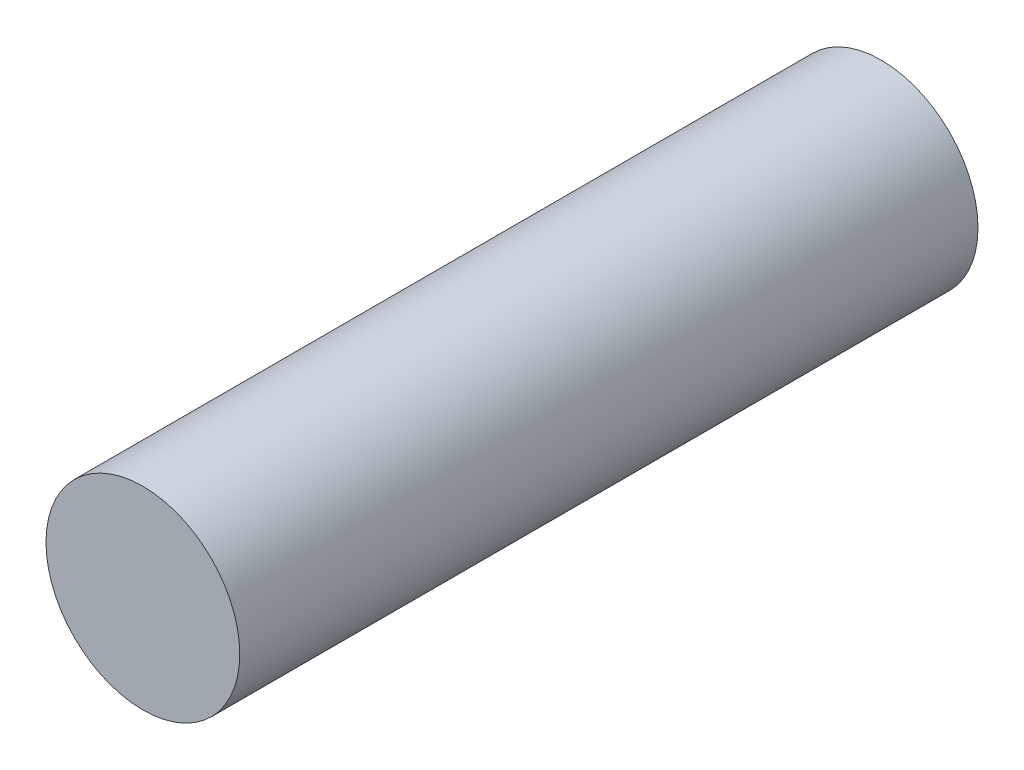
ISO-10303-21;
HEADER;
FILE_DESCRIPTION(('STEP AP214'),'2;1');
FILE_NAME('part.step','',(''),(''),'','','');
FILE_SCHEMA(('AUTOMOTIVE_DESIGN { 1 0 10303 214 1 1 1 1 }'));
ENDSEC;
DATA;
#1=APPLICATION_CONTEXT('core data for automotive mechanical design processes');
#2=APPLICATION_PROTOCOL_DEFINITION('international standard','automotive_design',2000,#1);
#3=PRODUCT_CONTEXT('',#1,'mechanical');
#4=PRODUCT('Part','Part','',(#3));
#5=PRODUCT_RELATED_PRODUCT_CATEGORY('part','',(#4));
#6=PRODUCT_DEFINITION_FORMATION('','',#4);
#7=PRODUCT_DEFINITION_CONTEXT('part definition',#1,'design');
#8=PRODUCT_DEFINITION('design','',#6,#7);
#9=PRODUCT_DEFINITION_SHAPE('','',#8);
#10=(LENGTH_UNIT() NAMED_UNIT(*) SI_UNIT(.MILLI.,.METRE.));
#11=(NAMED_UNIT(*) PLANE_ANGLE_UNIT() SI_UNIT($,.RADIAN.));
#12=(NAMED_UNIT(*) SI_UNIT($,.STERADIAN.) SOLID_ANGLE_UNIT());
#13=UNCERTAINTY_MEASURE_WITH_UNIT(LENGTH_MEASURE(1.E-05),#10,'distance_accuracy_value','');
#14=(GEOMETRIC_REPRESENTATION_CONTEXT(3) GLOBAL_UNCERTAINTY_ASSIGNED_CONTEXT((#13)) GLOBAL_UNIT_ASSIGNED_CONTEXT((#10,
#11,#12)) REPRESENTATION_CONTEXT('',''));
#15=CARTESIAN_POINT('',(0.,0.,0.));
#16=DIRECTION('',(0.,0.,1.));
#17=DIRECTION('',(1.,0.,0.));
#18=AXIS2_PLACEMENT_3D('',#15,#16,#17);
#19=CARTESIAN_POINT('',(0.,0.,19.05));
#20=DIRECTION('',(0.,0.,-1.));
#21=DIRECTION('',(-1.,0.,0.));
#22=AXIS2_PLACEMENT_3D('',#19,#20,#21);
#23=CYLINDRICAL_SURFACE('',#22,2.5);
#24=CARTESIAN_POINT('',(0.,0.,19.05));
#25=DIRECTION('',(0.,0.,1.));
#26=DIRECTION('',(1.,0.,0.));
#27=AXIS2_PLACEMENT_3D('',#24,#25,#26);
#28=CIRCLE('',#27,2.5);
#29=CARTESIAN_POINT('',(-2.5,0.,19.05));
#30=VERTEX_POINT('',#29);
#31=EDGE_CURVE('E10',#30,#30,#28,.T.);
#32=CARTESIAN_POINT('',(0.,0.,0.));
#33=DIRECTION('',(0.,0.,1.));
#34=DIRECTION('',(1.,0.,0.));
#35=AXIS2_PLACEMENT_3D('',#32,#33,#34);
#36=CIRCLE('',#35,2.5);
#37=CARTESIAN_POINT('',(-2.5,0.,0.));
#38=VERTEX_POINT('',#37);
#39=EDGE_CURVE('E34',#38,#38,#36,.T.);
#40=CARTESIAN_POINT('',(-2.5,0.,19.05));
#41=CARTESIAN_POINT('',(-2.5,0.,18.8515625));
#42=CARTESIAN_POINT('',(-2.5,0.,18.653125));
#43=CARTESIAN_POINT('',(-2.5,0.,18.25625));
#44=CARTESIAN_POINT('',(-2.5,0.,18.0578125));
#45=CARTESIAN_POINT('',(-2.5,0.,17.6609375));
#46=CARTESIAN_POINT('',(-2.5,0.,17.4625));
#47=CARTESIAN_POINT('',(-2.5,0.,17.065625));
#48=CARTESIAN_POINT('',(-2.5,0.,16.8671875));
#49=CARTESIAN_POINT('',(-2.5,0.,16.4703125));
#50=CARTESIAN_POINT('',(-2.5,0.,16.271875));
#51=CARTESIAN_POINT('',(-2.5,0.,15.875));
#52=CARTESIAN_POINT('',(-2.5,0.,15.6765625));
#53=CARTESIAN_POINT('',(-2.5,0.,15.2796875));
#54=CARTESIAN_POINT('',(-2.5,0.,15.08125));
#55=CARTESIAN_POINT('',(-2.5,0.,14.684375));
#56=CARTESIAN_POINT('',(-2.5,0.,14.4859375));
#57=CARTESIAN_POINT('',(-2.5,0.,14.0890625));
#58=CARTESIAN_POINT('',(-2.5,0.,13.890625));
#59=CARTESIAN_POINT('',(-2.5,0.,13.49375));
#60=CARTESIAN_POINT('',(-2.5,0.,13.2953125));
#61=CARTESIAN_POINT('',(-2.5,0.,12.8984375));
#62=CARTESIAN_POINT('',(-2.5,0.,12.7));
#63=CARTESIAN_POINT('',(-2.5,0.,12.303125));
#64=CARTESIAN_POINT('',(-2.5,0.,12.1046875));
#65=CARTESIAN_POINT('',(-2.5,0.,11.7078125));
#66=CARTESIAN_POINT('',(-2.5,0.,11.509375));
#67=CARTESIAN_POINT('',(-2.5,0.,11.1125));
#68=CARTESIAN_POINT('',(-2.5,0.,10.9140625));
#69=CARTESIAN_POINT('',(-2.5,0.,10.5171875));
#70=CARTESIAN_POINT('',(-2.5,0.,10.31875));
#71=CARTESIAN_POINT('',(-2.5,0.,9.921875));
#72=CARTESIAN_POINT('',(-2.5,0.,9.7234375));
#73=CARTESIAN_POINT('',(-2.5,0.,9.3265625));
#74=CARTESIAN_POINT('',(-2.5,0.,9.128125));
#75=CARTESIAN_POINT('',(-2.5,0.,8.73125));
#76=CARTESIAN_POINT('',(-2.5,0.,8.5328125));
#77=CARTESIAN_POINT('',(-2.5,0.,8.1359375));
#78=CARTESIAN_POINT('',(-2.5,0.,7.9375));
#79=CARTESIAN_POINT('',(-2.5,0.,7.540625));
#80=CARTESIAN_POINT('',(-2.5,0.,7.3421875));
#81=CARTESIAN_POINT('',(-2.5,0.,6.9453125));
#82=CARTESIAN_POINT('',(-2.5,0.,6.746875));
#83=CARTESIAN_POINT('',(-2.5,0.,6.35));
#84=CARTESIAN_POINT('',(-2.5,0.,6.1515625));
#85=CARTESIAN_POINT('',(-2.5,0.,5.7546875));
#86=CARTESIAN_POINT('',(-2.5,0.,5.55625));
#87=CARTESIAN_POINT('',(-2.5,0.,5.159375));
#88=CARTESIAN_POINT('',(-2.5,0.,4.9609375));
#89=CARTESIAN_POINT('',(-2.5,0.,4.5640625));
#90=CARTESIAN_POINT('',(-2.5,0.,4.365625));
#91=CARTESIAN_POINT('',(-2.5,0.,3.96875));
#92=CARTESIAN_POINT('',(-2.5,0.,3.7703125));
#93=CARTESIAN_POINT('',(-2.5,0.,3.3734375));
#94=CARTESIAN_POINT('',(-2.5,0.,3.175));
#95=CARTESIAN_POINT('',(-2.5,0.,2.778125));
#96=CARTESIAN_POINT('',(-2.5,0.,2.5796875));
#97=CARTESIAN_POINT('',(-2.5,0.,2.1828125));
#98=CARTESIAN_POINT('',(-2.5,0.,1.984375));
#99=CARTESIAN_POINT('',(-2.5,0.,1.5875));
#100=CARTESIAN_POINT('',(-2.5,0.,1.3890625));
#101=CARTESIAN_POINT('',(-2.5,0.,0.992187500000001));
#102=CARTESIAN_POINT('',(-2.5,0.,0.793750000000001));
#103=CARTESIAN_POINT('',(-2.5,0.,0.396875));
#104=CARTESIAN_POINT('',(-2.5,0.,0.1984375));
#105=CARTESIAN_POINT('',(-2.5,0.,0.));
#106=B_SPLINE_CURVE_WITH_KNOTS('',3,(#40,#41,#42,#43,#44,#45,#46,#47,#48,#49,#50,#51,#52,#53,
#54,#55,#56,#57,#58,#59,#60,#61,#62,#63,#64,#65,#66,#67,#68,#69,#70,#71,#72,#73,#74,#75,#76,#77,
#78,#79,#80,#81,#82,#83,#84,#85,#86,#87,#88,#89,#90,#91,#92,#93,#94,#95,#96,#97,#98,#99,#100,
#101,#102,#103,#104,#105),.UNSPECIFIED.,.F.,.F.,(4,2,2,2,2,2,2,2,2,2,2,2,2,2,2,2,2,2,2,2,2,2,2,
2,2,2,2,2,2,2,2,2,4),(0.,0.5953125,1.190625,1.7859375,2.38125,2.9765625,3.571875,4.1671875,
4.7625,5.3578125,5.953125,6.5484375,7.14375,7.7390625,8.334375,8.9296875,9.525,10.1203125,
10.715625,11.3109375,11.90625,12.5015625,13.096875,13.6921875,14.2875,14.8828125,15.478125,
16.0734375,16.66875,17.2640625,17.859375,18.4546875,19.05),.UNSPECIFIED.);
#107=EDGE_CURVE('BSEAM31',#30,#38,#106,.T.);
#108=ORIENTED_EDGE('',*,*,#31,.F.);
#109=ORIENTED_EDGE('',*,*,#39,.T.);
#110=ORIENTED_EDGE('',*,*,#107,.T.);
#111=ORIENTED_EDGE('',*,*,#107,.F.);
#112=EDGE_LOOP('',(#108,#110,#109,#111));
#113=FACE_BOUND('',#112,.T.);
#114=ADVANCED_FACE('F31',(#113),#23,.T.);
#115=CARTESIAN_POINT('',(0.,0.,19.05));
#116=DIRECTION('',(0.,0.,1.));
#117=DIRECTION('',(1.,0.,0.));
#118=AXIS2_PLACEMENT_3D('',#115,#116,#117);
#119=PLANE('',#118);
#120=ORIENTED_EDGE('',*,*,#31,.T.);
#121=EDGE_LOOP('',(#120));
#122=FACE_BOUND('',#121,.T.);
#123=ADVANCED_FACE('F46',(#122),#119,.T.);
#124=CARTESIAN_POINT('',(0.,0.,0.));
#125=DIRECTION('',(0.,0.,1.));
#126=DIRECTION('',(1.,0.,0.));
#127=AXIS2_PLACEMENT_3D('',#124,#125,#126);
#128=PLANE('',#127);
#129=ORIENTED_EDGE('',*,*,#39,.F.);
#130=EDGE_LOOP('',(#129));
#131=FACE_BOUND('',#130,.T.);
#132=ADVANCED_FACE('F44',(#131),#128,.F.);
#133=CLOSED_SHELL('',(#114,#123,#132));
#134=MANIFOLD_SOLID_BREP('B2',#133);
#135=ADVANCED_BREP_SHAPE_REPRESENTATION('',(#18,#134),#14);
#136=SHAPE_DEFINITION_REPRESENTATION(#9,#135);
ENDSEC;
END-ISO-10303-21;
